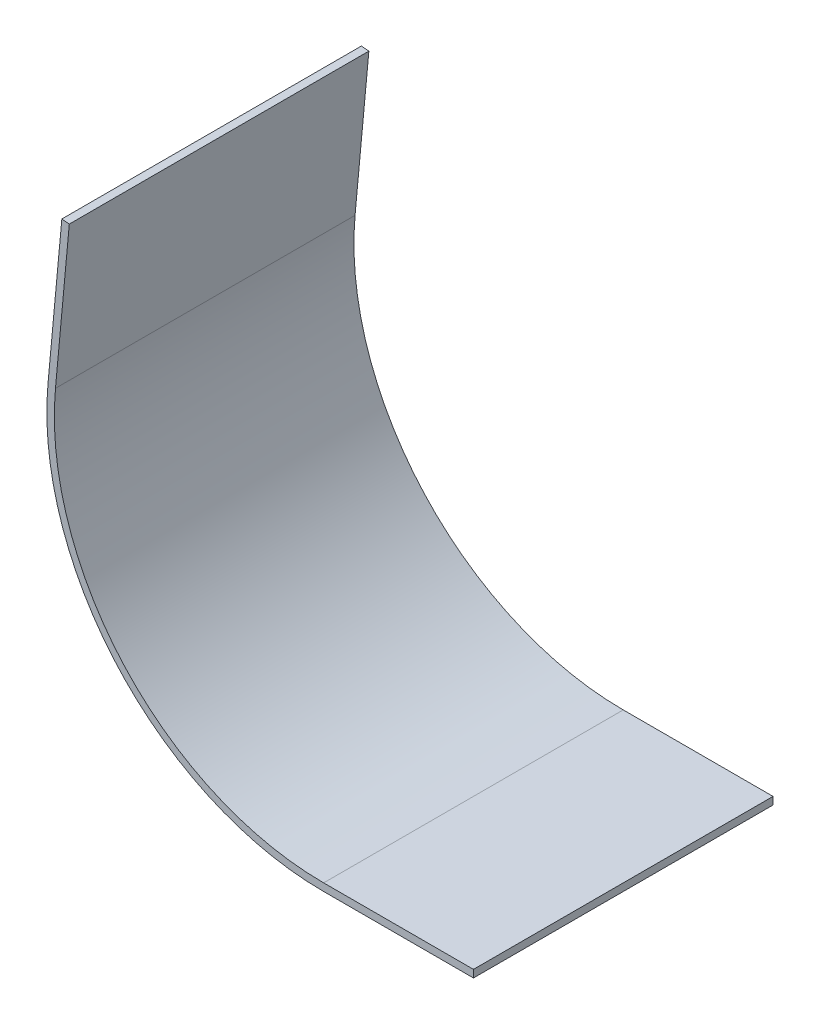
ISO-10303-21;
HEADER;
FILE_DESCRIPTION(('STEP AP214'),'2;1');
FILE_NAME('part.step','',(''),(''),'','','');
FILE_SCHEMA(('AUTOMOTIVE_DESIGN { 1 0 10303 214 1 1 1 1 }'));
ENDSEC;
DATA;
#1=APPLICATION_CONTEXT('core data for automotive mechanical design processes');
#2=APPLICATION_PROTOCOL_DEFINITION('international standard','automotive_design',2000,#1);
#3=PRODUCT_CONTEXT('',#1,'mechanical');
#4=PRODUCT('Part','Part','',(#3));
#5=PRODUCT_RELATED_PRODUCT_CATEGORY('part','',(#4));
#6=PRODUCT_DEFINITION_FORMATION('','',#4);
#7=PRODUCT_DEFINITION_CONTEXT('part definition',#1,'design');
#8=PRODUCT_DEFINITION('design','',#6,#7);
#9=PRODUCT_DEFINITION_SHAPE('','',#8);
#10=(LENGTH_UNIT() NAMED_UNIT(*) SI_UNIT(.MILLI.,.METRE.));
#11=(NAMED_UNIT(*) PLANE_ANGLE_UNIT() SI_UNIT($,.RADIAN.));
#12=(NAMED_UNIT(*) SI_UNIT($,.STERADIAN.) SOLID_ANGLE_UNIT());
#13=UNCERTAINTY_MEASURE_WITH_UNIT(LENGTH_MEASURE(1.E-05),#10,'distance_accuracy_value','');
#14=(GEOMETRIC_REPRESENTATION_CONTEXT(3) GLOBAL_UNCERTAINTY_ASSIGNED_CONTEXT((#13)) GLOBAL_UNIT_ASSIGNED_CONTEXT((#10,
#11,#12)) REPRESENTATION_CONTEXT('',''));
#15=CARTESIAN_POINT('',(0.,0.,0.));
#16=DIRECTION('',(0.,0.,1.));
#17=DIRECTION('',(1.,0.,0.));
#18=AXIS2_PLACEMENT_3D('',#15,#16,#17);
#19=CARTESIAN_POINT('',(10.,-0.250000000000352,-20.));
#20=DIRECTION('',(0.,-1.,0.));
#21=DIRECTION('',(0.,0.,-1.));
#22=AXIS2_PLACEMENT_3D('',#19,#20,#21);
#23=PLANE('',#22);
#24=DIRECTION('',(1.,0.,0.));
#25=VECTOR('',#24,1.);
#26=CARTESIAN_POINT('',(10.,-0.250000000000352,0.));
#27=LINE('',#26,#25);
#28=CARTESIAN_POINT('',(0.,-0.250000000000354,0.));
#29=VERTEX_POINT('',#28);
#30=CARTESIAN_POINT('',(10.,-0.250000000000352,0.));
#31=VERTEX_POINT('',#30);
#32=EDGE_CURVE('E136',#29,#31,#27,.T.);
#33=ORIENTED_EDGE('',*,*,#32,.F.);
#34=DIRECTION('',(0.,0.,1.));
#35=VECTOR('',#34,1.);
#36=CARTESIAN_POINT('',(0.,-0.250000000000354,-20.));
#37=LINE('',#36,#35);
#38=CARTESIAN_POINT('',(0.,-0.250000000000354,-20.));
#39=VERTEX_POINT('',#38);
#40=EDGE_CURVE('E11',#39,#29,#37,.T.);
#41=ORIENTED_EDGE('',*,*,#40,.F.);
#42=DIRECTION('',(1.,0.,0.));
#43=VECTOR('',#42,1.);
#44=CARTESIAN_POINT('',(10.,-0.250000000000352,-20.));
#45=LINE('',#44,#43);
#46=CARTESIAN_POINT('',(10.,-0.250000000000352,-20.));
#47=VERTEX_POINT('',#46);
#48=EDGE_CURVE('E156',#39,#47,#45,.T.);
#49=ORIENTED_EDGE('',*,*,#48,.T.);
#50=DIRECTION('',(0.,0.,1.));
#51=VECTOR('',#50,1.);
#52=CARTESIAN_POINT('',(10.,-0.250000000000352,-20.));
#53=LINE('',#52,#51);
#54=EDGE_CURVE('E42',#47,#31,#53,.T.);
#55=ORIENTED_EDGE('',*,*,#54,.T.);
#56=EDGE_LOOP('',(#33,#41,#49,#55));
#57=FACE_BOUND('',#56,.T.);
#58=ADVANCED_FACE('F39',(#57),#23,.T.);
#59=CARTESIAN_POINT('',(0.,18.2320255053177,-20.));
#60=DIRECTION('',(0.,0.,1.));
#61=DIRECTION('',(1.,0.,0.));
#62=AXIS2_PLACEMENT_3D('',#59,#60,#61);
#63=CYLINDRICAL_SURFACE('',#62,18.482025505318);
#64=CARTESIAN_POINT('',(0.,18.2320255053177,0.));
#65=DIRECTION('',(0.,0.,1.));
#66=DIRECTION('',(1.,0.,0.));
#67=AXIS2_PLACEMENT_3D('',#64,#65,#66);
#68=CIRCLE('',#67,18.482025505318);
#69=CARTESIAN_POINT('',(-18.4031487175867,19.9377171707758,0.));
#70=VERTEX_POINT('',#69);
#71=EDGE_CURVE('E154',#70,#29,#68,.T.);
#72=ORIENTED_EDGE('',*,*,#71,.F.);
#73=DIRECTION('',(0.,0.,1.));
#74=VECTOR('',#73,1.);
#75=CARTESIAN_POINT('',(-18.4031487175867,19.9377171707758,-20.));
#76=LINE('',#75,#74);
#77=CARTESIAN_POINT('',(-18.4031487175867,19.9377171707758,-20.));
#78=VERTEX_POINT('',#77);
#79=EDGE_CURVE('E48',#78,#70,#76,.T.);
#80=ORIENTED_EDGE('',*,*,#79,.F.);
#81=CARTESIAN_POINT('',(0.,18.2320255053177,-20.));
#82=DIRECTION('',(0.,0.,1.));
#83=DIRECTION('',(1.,0.,0.));
#84=AXIS2_PLACEMENT_3D('',#81,#82,#83);
#85=CIRCLE('',#84,18.482025505318);
#86=EDGE_CURVE('E126',#78,#39,#85,.T.);
#87=ORIENTED_EDGE('',*,*,#86,.T.);
#88=ORIENTED_EDGE('',*,*,#40,.T.);
#89=EDGE_LOOP('',(#72,#80,#87,#88));
#90=FACE_BOUND('',#89,.T.);
#91=ADVANCED_FACE('F168',(#90),#63,.T.);
#92=CARTESIAN_POINT('',(-17.4802565459644,29.8950396040187,-20.));
#93=DIRECTION('',(-0.99573224332427,0.0922892171622259,0.));
#94=DIRECTION('',(-0.0922892171622259,-0.99573224332427,0.));
#95=AXIS2_PLACEMENT_3D('',#92,#93,#94);
#96=PLANE('',#95);
#97=DIRECTION('',(-0.0922892171622259,-0.99573224332427,0.));
#98=VECTOR('',#97,1.);
#99=CARTESIAN_POINT('',(-17.4802565459644,29.8950396040187,0.));
#100=LINE('',#99,#98);
#101=CARTESIAN_POINT('',(-17.4802565459644,29.8950396040187,0.));
#102=VERTEX_POINT('',#101);
#103=EDGE_CURVE('E113',#102,#70,#100,.T.);
#104=ORIENTED_EDGE('',*,*,#103,.F.);
#105=DIRECTION('',(0.,0.,1.));
#106=VECTOR('',#105,1.);
#107=CARTESIAN_POINT('',(-17.4802565459644,29.8950396040187,-20.));
#108=LINE('',#107,#106);
#109=CARTESIAN_POINT('',(-17.4802565459644,29.8950396040187,-20.));
#110=VERTEX_POINT('',#109);
#111=EDGE_CURVE('E108',#110,#102,#108,.T.);
#112=ORIENTED_EDGE('',*,*,#111,.F.);
#113=DIRECTION('',(-0.0922892171622259,-0.99573224332427,0.));
#114=VECTOR('',#113,1.);
#115=CARTESIAN_POINT('',(-17.4802565459644,29.8950396040187,-20.));
#116=LINE('',#115,#114);
#117=EDGE_CURVE('E111',#110,#78,#116,.T.);
#118=ORIENTED_EDGE('',*,*,#117,.T.);
#119=ORIENTED_EDGE('',*,*,#79,.T.);
#120=EDGE_LOOP('',(#104,#112,#118,#119));
#121=FACE_BOUND('',#120,.T.);
#122=ADVANCED_FACE('F110',(#121),#96,.T.);
#123=CARTESIAN_POINT('',(-17.4802565459644,29.8950396040187,-20.));
#124=DIRECTION('',(0.0922892171622262,0.99573224332427,0.));
#125=DIRECTION('',(-0.99573224332427,0.0922892171622262,0.));
#126=AXIS2_PLACEMENT_3D('',#123,#124,#125);
#127=PLANE('',#126);
#128=DIRECTION('',(-0.99573224332427,0.0922892171622262,0.));
#129=VECTOR('',#128,1.);
#130=CARTESIAN_POINT('',(-17.4802565459644,29.8950396040187,0.));
#131=LINE('',#130,#129);
#132=CARTESIAN_POINT('',(-16.9823904243023,29.8488949954376,0.));
#133=VERTEX_POINT('',#132);
#134=EDGE_CURVE('E151',#133,#102,#131,.T.);
#135=ORIENTED_EDGE('',*,*,#134,.F.);
#136=DIRECTION('',(0.,0.,1.));
#137=VECTOR('',#136,1.);
#138=CARTESIAN_POINT('',(-16.9823904243023,29.8488949954376,-20.));
#139=LINE('',#138,#137);
#140=CARTESIAN_POINT('',(-16.9823904243023,29.8488949954376,-20.));
#141=VERTEX_POINT('',#140);
#142=EDGE_CURVE('E118',#141,#133,#139,.T.);
#143=ORIENTED_EDGE('',*,*,#142,.F.);
#144=DIRECTION('',(-0.99573224332427,0.0922892171622262,0.));
#145=VECTOR('',#144,1.);
#146=CARTESIAN_POINT('',(-17.4802565459644,29.8950396040187,-20.));
#147=LINE('',#146,#145);
#148=EDGE_CURVE('E124',#141,#110,#147,.T.);
#149=ORIENTED_EDGE('',*,*,#148,.T.);
#150=ORIENTED_EDGE('',*,*,#111,.T.);
#151=EDGE_LOOP('',(#135,#143,#149,#150));
#152=FACE_BOUND('',#151,.T.);
#153=ADVANCED_FACE('F128',(#152),#127,.T.);
#154=CARTESIAN_POINT('',(-16.9823904243023,29.8488949954376,-20.));
#155=DIRECTION('',(0.99573224332427,-0.0922892171622265,0.));
#156=DIRECTION('',(0.0922892171622265,0.99573224332427,0.));
#157=AXIS2_PLACEMENT_3D('',#154,#155,#156);
#158=PLANE('',#157);
#159=DIRECTION('',(0.0922892171622265,0.99573224332427,0.));
#160=VECTOR('',#159,1.);
#161=CARTESIAN_POINT('',(-16.9823904243023,29.8488949954376,0.));
#162=LINE('',#161,#160);
#163=CARTESIAN_POINT('',(-17.9052825959246,19.8915725621947,0.));
#164=VERTEX_POINT('',#163);
#165=EDGE_CURVE('E148',#164,#133,#162,.T.);
#166=ORIENTED_EDGE('',*,*,#165,.F.);
#167=DIRECTION('',(0.,0.,1.));
#168=VECTOR('',#167,1.);
#169=CARTESIAN_POINT('',(-17.9052825959246,19.8915725621947,-20.));
#170=LINE('',#169,#168);
#171=CARTESIAN_POINT('',(-17.9052825959246,19.8915725621947,-20.));
#172=VERTEX_POINT('',#171);
#173=EDGE_CURVE('E160',#172,#164,#170,.T.);
#174=ORIENTED_EDGE('',*,*,#173,.F.);
#175=DIRECTION('',(0.0922892171622265,0.99573224332427,0.));
#176=VECTOR('',#175,1.);
#177=CARTESIAN_POINT('',(-16.9823904243023,29.8488949954376,-20.));
#178=LINE('',#177,#176);
#179=EDGE_CURVE('E129',#172,#141,#178,.T.);
#180=ORIENTED_EDGE('',*,*,#179,.T.);
#181=ORIENTED_EDGE('',*,*,#142,.T.);
#182=EDGE_LOOP('',(#166,#174,#180,#181));
#183=FACE_BOUND('',#182,.T.);
#184=ADVANCED_FACE('F181',(#183),#158,.T.);
#185=CARTESIAN_POINT('',(0.,18.2320255053177,-20.));
#186=DIRECTION('',(0.,0.,1.));
#187=DIRECTION('',(1.,0.,0.));
#188=AXIS2_PLACEMENT_3D('',#185,#186,#187);
#189=CYLINDRICAL_SURFACE('',#188,17.982025505318);
#190=CARTESIAN_POINT('',(0.,18.2320255053177,0.));
#191=DIRECTION('',(0.,0.,-1.));
#192=DIRECTION('',(-1.,0.,0.));
#193=AXIS2_PLACEMENT_3D('',#190,#191,#192);
#194=CIRCLE('',#193,17.982025505318);
#195=CARTESIAN_POINT('',(0.,0.249999999999648,0.));
#196=VERTEX_POINT('',#195);
#197=EDGE_CURVE('E145',#196,#164,#194,.T.);
#198=ORIENTED_EDGE('',*,*,#197,.F.);
#199=DIRECTION('',(0.,0.,1.));
#200=VECTOR('',#199,1.);
#201=CARTESIAN_POINT('',(0.,0.249999999999648,-20.));
#202=LINE('',#201,#200);
#203=CARTESIAN_POINT('',(0.,0.249999999999648,-20.));
#204=VERTEX_POINT('',#203);
#205=EDGE_CURVE('E162',#204,#196,#202,.T.);
#206=ORIENTED_EDGE('',*,*,#205,.F.);
#207=CARTESIAN_POINT('',(0.,18.2320255053177,-20.));
#208=DIRECTION('',(0.,0.,-1.));
#209=DIRECTION('',(-1.,0.,0.));
#210=AXIS2_PLACEMENT_3D('',#207,#208,#209);
#211=CIRCLE('',#210,17.982025505318);
#212=EDGE_CURVE('E131',#204,#172,#211,.T.);
#213=ORIENTED_EDGE('',*,*,#212,.T.);
#214=ORIENTED_EDGE('',*,*,#173,.T.);
#215=EDGE_LOOP('',(#198,#206,#213,#214));
#216=FACE_BOUND('',#215,.T.);
#217=ADVANCED_FACE('F184',(#216),#189,.F.);
#218=CARTESIAN_POINT('',(10.,0.249999999999648,-20.));
#219=DIRECTION('',(0.,1.,0.));
#220=DIRECTION('',(0.,0.,1.));
#221=AXIS2_PLACEMENT_3D('',#218,#219,#220);
#222=PLANE('',#221);
#223=DIRECTION('',(-1.,0.,0.));
#224=VECTOR('',#223,1.);
#225=CARTESIAN_POINT('',(10.,0.249999999999648,0.));
#226=LINE('',#225,#224);
#227=CARTESIAN_POINT('',(10.,0.249999999999648,0.));
#228=VERTEX_POINT('',#227);
#229=EDGE_CURVE('E142',#228,#196,#226,.T.);
#230=ORIENTED_EDGE('',*,*,#229,.F.);
#231=DIRECTION('',(0.,0.,1.));
#232=VECTOR('',#231,1.);
#233=CARTESIAN_POINT('',(10.,0.249999999999648,-20.));
#234=LINE('',#233,#232);
#235=CARTESIAN_POINT('',(10.,0.249999999999648,-20.));
#236=VERTEX_POINT('',#235);
#237=EDGE_CURVE('E163',#236,#228,#234,.T.);
#238=ORIENTED_EDGE('',*,*,#237,.F.);
#239=DIRECTION('',(-1.,0.,0.));
#240=VECTOR('',#239,1.);
#241=CARTESIAN_POINT('',(10.,0.249999999999648,-20.));
#242=LINE('',#241,#240);
#243=EDGE_CURVE('E259',#236,#204,#242,.T.);
#244=ORIENTED_EDGE('',*,*,#243,.T.);
#245=ORIENTED_EDGE('',*,*,#205,.T.);
#246=EDGE_LOOP('',(#230,#238,#244,#245));
#247=FACE_BOUND('',#246,.T.);
#248=ADVANCED_FACE('F188',(#247),#222,.T.);
#249=CARTESIAN_POINT('',(10.,-0.250000000000352,-20.));
#250=DIRECTION('',(1.,0.,0.));
#251=DIRECTION('',(0.,0.,-1.));
#252=AXIS2_PLACEMENT_3D('',#249,#250,#251);
#253=PLANE('',#252);
#254=DIRECTION('',(0.,1.,0.));
#255=VECTOR('',#254,1.);
#256=CARTESIAN_POINT('',(10.,-0.250000000000352,0.));
#257=LINE('',#256,#255);
#258=EDGE_CURVE('E139',#31,#228,#257,.T.);
#259=ORIENTED_EDGE('',*,*,#258,.F.);
#260=ORIENTED_EDGE('',*,*,#54,.F.);
#261=DIRECTION('',(0.,1.,0.));
#262=VECTOR('',#261,1.);
#263=CARTESIAN_POINT('',(10.,-0.250000000000352,-20.));
#264=LINE('',#263,#262);
#265=EDGE_CURVE('E260',#47,#236,#264,.T.);
#266=ORIENTED_EDGE('',*,*,#265,.T.);
#267=ORIENTED_EDGE('',*,*,#237,.T.);
#268=EDGE_LOOP('',(#259,#260,#266,#267));
#269=FACE_BOUND('',#268,.T.);
#270=ADVANCED_FACE('F165',(#269),#253,.T.);
#271=CARTESIAN_POINT('',(0.,18.2320255053177,-20.));
#272=DIRECTION('',(0.,0.,1.));
#273=DIRECTION('',(1.,0.,0.));
#274=AXIS2_PLACEMENT_3D('',#271,#272,#273);
#275=PLANE('',#274);
#276=ORIENTED_EDGE('',*,*,#48,.F.);
#277=ORIENTED_EDGE('',*,*,#86,.F.);
#278=ORIENTED_EDGE('',*,*,#117,.F.);
#279=ORIENTED_EDGE('',*,*,#148,.F.);
#280=ORIENTED_EDGE('',*,*,#179,.F.);
#281=ORIENTED_EDGE('',*,*,#212,.F.);
#282=ORIENTED_EDGE('',*,*,#243,.F.);
#283=ORIENTED_EDGE('',*,*,#265,.F.);
#284=EDGE_LOOP('',(#276,#277,#278,#279,#280,#281,#282,#283));
#285=FACE_BOUND('',#284,.T.);
#286=ADVANCED_FACE('F122',(#285),#275,.F.);
#287=CARTESIAN_POINT('',(0.,18.2320255053177,0.));
#288=DIRECTION('',(0.,0.,1.));
#289=DIRECTION('',(1.,0.,0.));
#290=AXIS2_PLACEMENT_3D('',#287,#288,#289);
#291=PLANE('',#290);
#292=ORIENTED_EDGE('',*,*,#32,.T.);
#293=ORIENTED_EDGE('',*,*,#258,.T.);
#294=ORIENTED_EDGE('',*,*,#229,.T.);
#295=ORIENTED_EDGE('',*,*,#197,.T.);
#296=ORIENTED_EDGE('',*,*,#165,.T.);
#297=ORIENTED_EDGE('',*,*,#134,.T.);
#298=ORIENTED_EDGE('',*,*,#103,.T.);
#299=ORIENTED_EDGE('',*,*,#71,.T.);
#300=EDGE_LOOP('',(#292,#293,#294,#295,#296,#297,#298,#299));
#301=FACE_BOUND('',#300,.T.);
#302=ADVANCED_FACE('F167',(#301),#291,.T.);
#303=CLOSED_SHELL('',(#58,#91,#122,#153,#184,#217,#248,#270,#286,#302));
#304=MANIFOLD_SOLID_BREP('B2',#303);
#305=ADVANCED_BREP_SHAPE_REPRESENTATION('',(#18,#304),#14);
#306=SHAPE_DEFINITION_REPRESENTATION(#9,#305);
ENDSEC;
END-ISO-10303-21;
